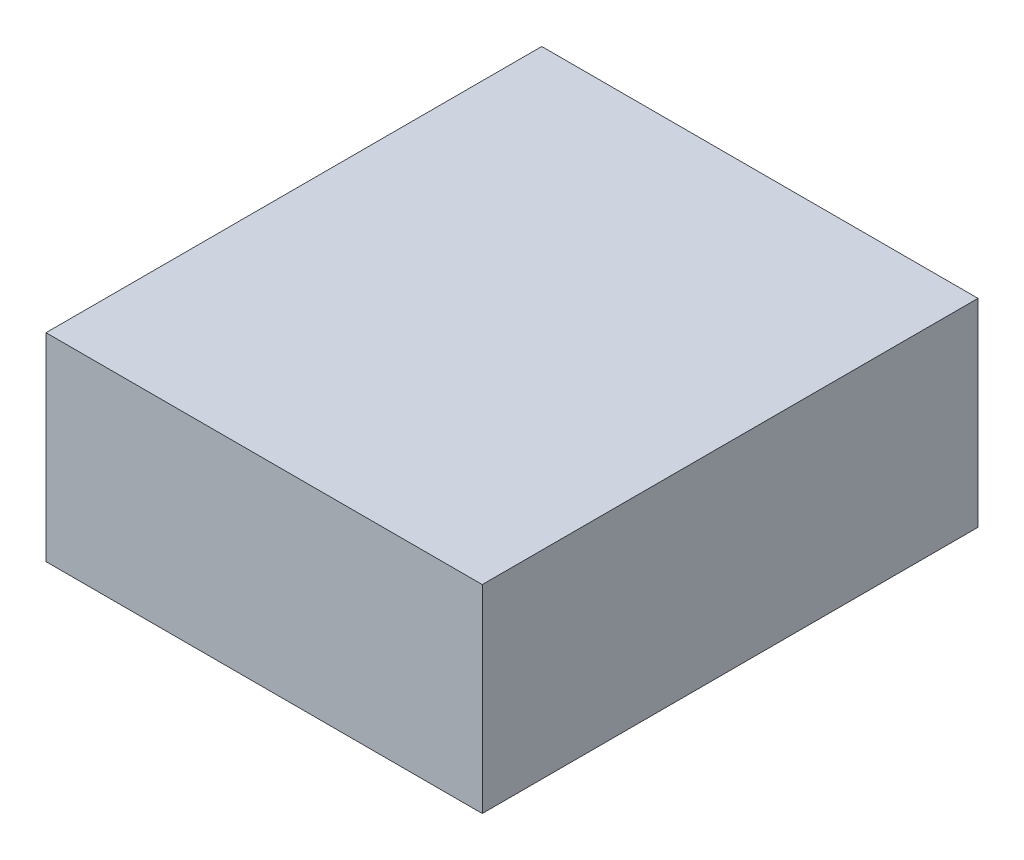
ISO-10303-21;
HEADER;
FILE_DESCRIPTION(('STEP AP214'),'2;1');
FILE_NAME('part.step','',(''),(''),'','','');
FILE_SCHEMA(('AUTOMOTIVE_DESIGN { 1 0 10303 214 1 1 1 1 }'));
ENDSEC;
DATA;
#1=APPLICATION_CONTEXT('core data for automotive mechanical design processes');
#2=APPLICATION_PROTOCOL_DEFINITION('international standard','automotive_design',2000,#1);
#3=PRODUCT_CONTEXT('',#1,'mechanical');
#4=PRODUCT('Part','Part','',(#3));
#5=PRODUCT_RELATED_PRODUCT_CATEGORY('part','',(#4));
#6=PRODUCT_DEFINITION_FORMATION('','',#4);
#7=PRODUCT_DEFINITION_CONTEXT('part definition',#1,'design');
#8=PRODUCT_DEFINITION('design','',#6,#7);
#9=PRODUCT_DEFINITION_SHAPE('','',#8);
#10=(LENGTH_UNIT() NAMED_UNIT(*) SI_UNIT(.MILLI.,.METRE.));
#11=(NAMED_UNIT(*) PLANE_ANGLE_UNIT() SI_UNIT($,.RADIAN.));
#12=(NAMED_UNIT(*) SI_UNIT($,.STERADIAN.) SOLID_ANGLE_UNIT());
#13=UNCERTAINTY_MEASURE_WITH_UNIT(LENGTH_MEASURE(1.E-05),#10,'distance_accuracy_value','');
#14=(GEOMETRIC_REPRESENTATION_CONTEXT(3) GLOBAL_UNCERTAINTY_ASSIGNED_CONTEXT((#13)) GLOBAL_UNIT_ASSIGNED_CONTEXT((#10,
#11,#12)) REPRESENTATION_CONTEXT('',''));
#15=CARTESIAN_POINT('',(0.,0.,0.));
#16=DIRECTION('',(0.,0.,1.));
#17=DIRECTION('',(1.,0.,0.));
#18=AXIS2_PLACEMENT_3D('',#15,#16,#17);
#19=CARTESIAN_POINT('',(110.,100.,125.));
#20=DIRECTION('',(-1.,0.,0.));
#21=DIRECTION('',(0.,0.,1.));
#22=AXIS2_PLACEMENT_3D('',#19,#20,#21);
#23=PLANE('',#22);
#24=DIRECTION('',(0.,0.,-1.));
#25=VECTOR('',#24,1.);
#26=CARTESIAN_POINT('',(110.,0.,125.));
#27=LINE('',#26,#25);
#28=CARTESIAN_POINT('',(110.,0.,125.));
#29=VERTEX_POINT('',#28);
#30=CARTESIAN_POINT('',(110.,0.,-125.));
#31=VERTEX_POINT('',#30);
#32=EDGE_CURVE('E96',#29,#31,#27,.T.);
#33=ORIENTED_EDGE('',*,*,#32,.T.);
#34=DIRECTION('',(0.,-1.,0.));
#35=VECTOR('',#34,1.);
#36=CARTESIAN_POINT('',(110.,100.,-125.));
#37=LINE('',#36,#35);
#38=CARTESIAN_POINT('',(110.,100.,-125.));
#39=VERTEX_POINT('',#38);
#40=EDGE_CURVE('E11',#39,#31,#37,.T.);
#41=ORIENTED_EDGE('',*,*,#40,.F.);
#42=DIRECTION('',(0.,0.,-1.));
#43=VECTOR('',#42,1.);
#44=CARTESIAN_POINT('',(110.,100.,125.));
#45=LINE('',#44,#43);
#46=CARTESIAN_POINT('',(110.,100.,125.));
#47=VERTEX_POINT('',#46);
#48=EDGE_CURVE('E84',#47,#39,#45,.T.);
#49=ORIENTED_EDGE('',*,*,#48,.F.);
#50=DIRECTION('',(0.,-1.,0.));
#51=VECTOR('',#50,1.);
#52=CARTESIAN_POINT('',(110.,100.,125.));
#53=LINE('',#52,#51);
#54=EDGE_CURVE('E92',#47,#29,#53,.T.);
#55=ORIENTED_EDGE('',*,*,#54,.T.);
#56=EDGE_LOOP('',(#33,#41,#49,#55));
#57=FACE_BOUND('',#56,.T.);
#58=ADVANCED_FACE('F33',(#57),#23,.F.);
#59=CARTESIAN_POINT('',(-110.,100.,-125.));
#60=DIRECTION('',(0.,0.,1.));
#61=DIRECTION('',(1.,0.,0.));
#62=AXIS2_PLACEMENT_3D('',#59,#60,#61);
#63=PLANE('',#62);
#64=DIRECTION('',(-1.,0.,0.));
#65=VECTOR('',#64,1.);
#66=CARTESIAN_POINT('',(-110.,0.,-125.));
#67=LINE('',#66,#65);
#68=CARTESIAN_POINT('',(-110.,0.,-125.));
#69=VERTEX_POINT('',#68);
#70=EDGE_CURVE('E88',#31,#69,#67,.T.);
#71=ORIENTED_EDGE('',*,*,#70,.T.);
#72=DIRECTION('',(0.,-1.,0.));
#73=VECTOR('',#72,1.);
#74=CARTESIAN_POINT('',(-110.,100.,-125.));
#75=LINE('',#74,#73);
#76=CARTESIAN_POINT('',(-110.,100.,-125.));
#77=VERTEX_POINT('',#76);
#78=EDGE_CURVE('E41',#77,#69,#75,.T.);
#79=ORIENTED_EDGE('',*,*,#78,.F.);
#80=DIRECTION('',(-1.,0.,0.));
#81=VECTOR('',#80,1.);
#82=CARTESIAN_POINT('',(-110.,100.,-125.));
#83=LINE('',#82,#81);
#84=EDGE_CURVE('E79',#39,#77,#83,.T.);
#85=ORIENTED_EDGE('',*,*,#84,.F.);
#86=ORIENTED_EDGE('',*,*,#40,.T.);
#87=EDGE_LOOP('',(#71,#79,#85,#86));
#88=FACE_BOUND('',#87,.T.);
#89=ADVANCED_FACE('F87',(#88),#63,.F.);
#90=CARTESIAN_POINT('',(-110.,100.,125.));
#91=DIRECTION('',(1.,0.,0.));
#92=DIRECTION('',(0.,0.,-1.));
#93=AXIS2_PLACEMENT_3D('',#90,#91,#92);
#94=PLANE('',#93);
#95=DIRECTION('',(0.,0.,1.));
#96=VECTOR('',#95,1.);
#97=CARTESIAN_POINT('',(-110.,0.,125.));
#98=LINE('',#97,#96);
#99=CARTESIAN_POINT('',(-110.,0.,125.));
#100=VERTEX_POINT('',#99);
#101=EDGE_CURVE('E66',#69,#100,#98,.T.);
#102=ORIENTED_EDGE('',*,*,#101,.T.);
#103=DIRECTION('',(0.,-1.,0.));
#104=VECTOR('',#103,1.);
#105=CARTESIAN_POINT('',(-110.,100.,125.));
#106=LINE('',#105,#104);
#107=CARTESIAN_POINT('',(-110.,100.,125.));
#108=VERTEX_POINT('',#107);
#109=EDGE_CURVE('E89',#108,#100,#106,.T.);
#110=ORIENTED_EDGE('',*,*,#109,.F.);
#111=DIRECTION('',(0.,0.,1.));
#112=VECTOR('',#111,1.);
#113=CARTESIAN_POINT('',(-110.,100.,125.));
#114=LINE('',#113,#112);
#115=EDGE_CURVE('E82',#77,#108,#114,.T.);
#116=ORIENTED_EDGE('',*,*,#115,.F.);
#117=ORIENTED_EDGE('',*,*,#78,.T.);
#118=EDGE_LOOP('',(#102,#110,#116,#117));
#119=FACE_BOUND('',#118,.T.);
#120=ADVANCED_FACE('F90',(#119),#94,.F.);
#121=CARTESIAN_POINT('',(-110.,100.,125.));
#122=DIRECTION('',(0.,0.,-1.));
#123=DIRECTION('',(-1.,0.,0.));
#124=AXIS2_PLACEMENT_3D('',#121,#122,#123);
#125=PLANE('',#124);
#126=DIRECTION('',(1.,0.,0.));
#127=VECTOR('',#126,1.);
#128=CARTESIAN_POINT('',(-110.,0.,125.));
#129=LINE('',#128,#127);
#130=EDGE_CURVE('E72',#100,#29,#129,.T.);
#131=ORIENTED_EDGE('',*,*,#130,.T.);
#132=ORIENTED_EDGE('',*,*,#54,.F.);
#133=DIRECTION('',(1.,0.,0.));
#134=VECTOR('',#133,1.);
#135=CARTESIAN_POINT('',(-110.,100.,125.));
#136=LINE('',#135,#134);
#137=EDGE_CURVE('E49',#108,#47,#136,.T.);
#138=ORIENTED_EDGE('',*,*,#137,.F.);
#139=ORIENTED_EDGE('',*,*,#109,.T.);
#140=EDGE_LOOP('',(#131,#132,#138,#139));
#141=FACE_BOUND('',#140,.T.);
#142=ADVANCED_FACE('F103',(#141),#125,.F.);
#143=CARTESIAN_POINT('',(0.,100.,0.));
#144=DIRECTION('',(0.,-1.,0.));
#145=DIRECTION('',(0.,0.,-1.));
#146=AXIS2_PLACEMENT_3D('',#143,#144,#145);
#147=PLANE('',#146);
#148=ORIENTED_EDGE('',*,*,#48,.T.);
#149=ORIENTED_EDGE('',*,*,#84,.T.);
#150=ORIENTED_EDGE('',*,*,#115,.T.);
#151=ORIENTED_EDGE('',*,*,#137,.T.);
#152=EDGE_LOOP('',(#148,#149,#150,#151));
#153=FACE_BOUND('',#152,.T.);
#154=ADVANCED_FACE('F80',(#153),#147,.F.);
#155=CARTESIAN_POINT('',(0.,0.,0.));
#156=DIRECTION('',(0.,-1.,0.));
#157=DIRECTION('',(0.,0.,-1.));
#158=AXIS2_PLACEMENT_3D('',#155,#156,#157);
#159=PLANE('',#158);
#160=ORIENTED_EDGE('',*,*,#32,.F.);
#161=ORIENTED_EDGE('',*,*,#130,.F.);
#162=ORIENTED_EDGE('',*,*,#101,.F.);
#163=ORIENTED_EDGE('',*,*,#70,.F.);
#164=EDGE_LOOP('',(#160,#161,#162,#163));
#165=FACE_BOUND('',#164,.T.);
#166=ADVANCED_FACE('F106',(#165),#159,.T.);
#167=CLOSED_SHELL('',(#58,#89,#120,#142,#154,#166));
#168=MANIFOLD_SOLID_BREP('B2',#167);
#169=ADVANCED_BREP_SHAPE_REPRESENTATION('',(#18,#168),#14);
#170=SHAPE_DEFINITION_REPRESENTATION(#9,#169);
ENDSEC;
END-ISO-10303-21;
